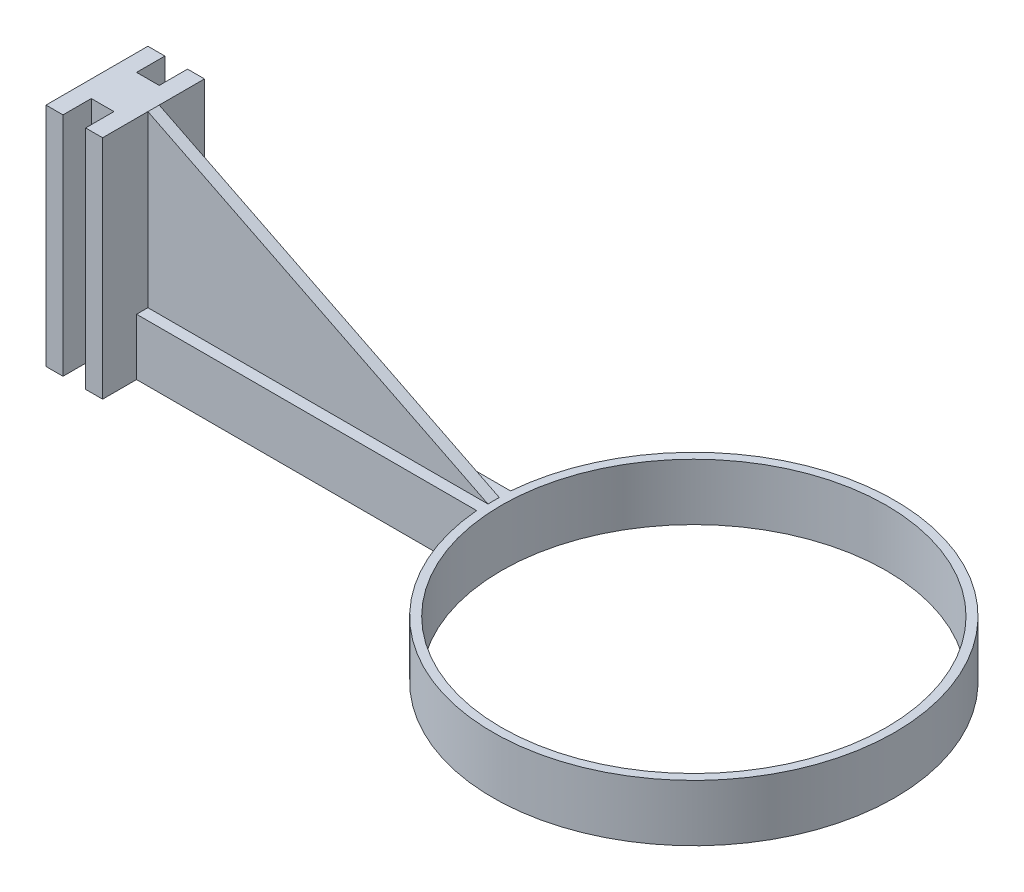
ISO-10303-21;
HEADER;
FILE_DESCRIPTION(('STEP AP214'),'2;1');
FILE_NAME('part.step','',(''),(''),'','','');
FILE_SCHEMA(('AUTOMOTIVE_DESIGN { 1 0 10303 214 1 1 1 1 }'));
ENDSEC;
DATA;
#1=APPLICATION_CONTEXT('core data for automotive mechanical design processes');
#2=APPLICATION_PROTOCOL_DEFINITION('international standard','automotive_design',2000,#1);
#3=PRODUCT_CONTEXT('',#1,'mechanical');
#4=PRODUCT('Part','Part','',(#3));
#5=PRODUCT_RELATED_PRODUCT_CATEGORY('part','',(#4));
#6=PRODUCT_DEFINITION_FORMATION('','',#4);
#7=PRODUCT_DEFINITION_CONTEXT('part definition',#1,'design');
#8=PRODUCT_DEFINITION('design','',#6,#7);
#9=PRODUCT_DEFINITION_SHAPE('','',#8);
#10=(LENGTH_UNIT() NAMED_UNIT(*) SI_UNIT(.MILLI.,.METRE.));
#11=(NAMED_UNIT(*) PLANE_ANGLE_UNIT() SI_UNIT($,.RADIAN.));
#12=(NAMED_UNIT(*) SI_UNIT($,.STERADIAN.) SOLID_ANGLE_UNIT());
#13=UNCERTAINTY_MEASURE_WITH_UNIT(LENGTH_MEASURE(1.E-05),#10,'distance_accuracy_value','');
#14=(GEOMETRIC_REPRESENTATION_CONTEXT(3) GLOBAL_UNCERTAINTY_ASSIGNED_CONTEXT((#13)) GLOBAL_UNIT_ASSIGNED_CONTEXT((#10,
#11,#12)) REPRESENTATION_CONTEXT('',''));
#15=CARTESIAN_POINT('',(0.,0.,0.));
#16=DIRECTION('',(0.,0.,1.));
#17=DIRECTION('',(1.,0.,0.));
#18=AXIS2_PLACEMENT_3D('',#15,#16,#17);
#19=CARTESIAN_POINT('',(0.,5.,0.));
#20=DIRECTION('',(0.,1.,0.));
#21=DIRECTION('',(0.,0.,1.));
#22=AXIS2_PLACEMENT_3D('',#19,#20,#21);
#23=PLANE('',#22);
#24=CARTESIAN_POINT('',(0.,5.,0.));
#25=DIRECTION('',(0.,1.,0.));
#26=DIRECTION('',(0.,0.,1.));
#27=AXIS2_PLACEMENT_3D('',#24,#25,#26);
#28=CIRCLE('',#27,17.);
#29=CARTESIAN_POINT('',(0.,5.,17.));
#30=VERTEX_POINT('',#29);
#31=EDGE_CURVE('E200',#30,#30,#28,.T.);
#32=ORIENTED_EDGE('',*,*,#31,.F.);
#33=EDGE_LOOP('',(#32));
#34=FACE_BOUND('',#33,.T.);
#35=DIRECTION('',(0.,0.,-1.));
#36=VECTOR('',#35,1.);
#37=CARTESIAN_POINT('',(-47.7201518551234,5.,0.));
#38=LINE('',#37,#36);
#39=CARTESIAN_POINT('',(-47.7201518551234,5.,-0.499999999999994));
#40=VERTEX_POINT('',#39);
#41=CARTESIAN_POINT('',(-47.7201518551234,5.,-1.49999999999999));
#42=VERTEX_POINT('',#41);
#43=EDGE_CURVE('E86',#40,#42,#38,.T.);
#44=ORIENTED_EDGE('',*,*,#43,.F.);
#45=DIRECTION('',(1.,0.,0.));
#46=VECTOR('',#45,1.);
#47=CARTESIAN_POINT('',(-17.686506155824,5.,-0.499999999999994));
#48=LINE('',#47,#46);
#49=CARTESIAN_POINT('',(-17.686506155824,5.,-0.499999999999994));
#50=VERTEX_POINT('',#49);
#51=EDGE_CURVE('E177',#40,#50,#48,.T.);
#52=ORIENTED_EDGE('',*,*,#51,.T.);
#53=DIRECTION('',(0.,0.,1.));
#54=VECTOR('',#53,1.);
#55=CARTESIAN_POINT('',(-17.686506155824,5.,-0.499999999999994));
#56=LINE('',#55,#54);
#57=CARTESIAN_POINT('',(-17.686506155824,5.,0.500000000000006));
#58=VERTEX_POINT('',#57);
#59=EDGE_CURVE('E363',#50,#58,#56,.T.);
#60=ORIENTED_EDGE('',*,*,#59,.T.);
#61=DIRECTION('',(1.,0.,0.));
#62=VECTOR('',#61,1.);
#63=CARTESIAN_POINT('',(-17.686506155824,5.,0.500000000000006));
#64=LINE('',#63,#62);
#65=CARTESIAN_POINT('',(-47.7201518551234,5.,0.500000000000006));
#66=VERTEX_POINT('',#65);
#67=EDGE_CURVE('E366',#66,#58,#64,.T.);
#68=ORIENTED_EDGE('',*,*,#67,.F.);
#69=CARTESIAN_POINT('',(-47.7201518551234,5.,1.50000000000001));
#70=VERTEX_POINT('',#69);
#71=EDGE_CURVE('E190',#70,#66,#38,.T.);
#72=ORIENTED_EDGE('',*,*,#71,.F.);
#73=DIRECTION('',(1.,0.,0.));
#74=VECTOR('',#73,1.);
#75=CARTESIAN_POINT('',(0.,5.,1.50000000000001));
#76=LINE('',#75,#74);
#77=CARTESIAN_POINT('',(-17.686506155824,5.,1.50000000000001));
#78=VERTEX_POINT('',#77);
#79=EDGE_CURVE('E193',#70,#78,#76,.T.);
#80=ORIENTED_EDGE('',*,*,#79,.T.);
#81=CARTESIAN_POINT('',(0.,5.,0.));
#82=DIRECTION('',(0.,1.,0.));
#83=DIRECTION('',(0.,0.,1.));
#84=AXIS2_PLACEMENT_3D('',#81,#82,#83);
#85=CIRCLE('',#84,17.75);
#86=CARTESIAN_POINT('',(-17.686506155824,5.,-1.49999999999999));
#87=VERTEX_POINT('',#86);
#88=EDGE_CURVE('E61',#78,#87,#85,.T.);
#89=ORIENTED_EDGE('',*,*,#88,.T.);
#90=DIRECTION('',(1.,0.,0.));
#91=VECTOR('',#90,1.);
#92=CARTESIAN_POINT('',(0.,5.,-1.49999999999999));
#93=LINE('',#92,#91);
#94=EDGE_CURVE('E189',#42,#87,#93,.T.);
#95=ORIENTED_EDGE('',*,*,#94,.F.);
#96=EDGE_LOOP('',(#44,#52,#60,#68,#72,#80,#89,#95));
#97=FACE_BOUND('',#96,.T.);
#98=ADVANCED_FACE('F35',(#34,#97),#23,.T.);
#99=CARTESIAN_POINT('',(-47.7201518551234,20.,0.));
#100=DIRECTION('',(-1.,0.,0.));
#101=DIRECTION('',(0.,0.,1.));
#102=AXIS2_PLACEMENT_3D('',#99,#100,#101);
#103=PLANE('',#102);
#104=DIRECTION('',(0.,-1.,0.));
#105=VECTOR('',#104,1.);
#106=CARTESIAN_POINT('',(-47.7201518551234,5.,-0.499999999999994));
#107=LINE('',#106,#105);
#108=CARTESIAN_POINT('',(-47.7201518551234,20.,-0.499999999999994));
#109=VERTEX_POINT('',#108);
#110=EDGE_CURVE('E179',#109,#40,#107,.T.);
#111=ORIENTED_EDGE('',*,*,#110,.T.);
#112=ORIENTED_EDGE('',*,*,#43,.T.);
#113=DIRECTION('',(0.,-1.,0.));
#114=VECTOR('',#113,1.);
#115=CARTESIAN_POINT('',(-47.7201518551234,5.,-1.49999999999999));
#116=LINE('',#115,#114);
#117=CARTESIAN_POINT('',(-47.7201518551234,0.,-1.49999999999999));
#118=VERTEX_POINT('',#117);
#119=EDGE_CURVE('E11',#42,#118,#116,.T.);
#120=ORIENTED_EDGE('',*,*,#119,.T.);
#121=DIRECTION('',(0.,0.,-1.));
#122=VECTOR('',#121,1.);
#123=CARTESIAN_POINT('',(-47.7201518551234,0.,0.));
#124=LINE('',#123,#122);
#125=CARTESIAN_POINT('',(-47.7201518551234,0.,-4.49999999999999));
#126=VERTEX_POINT('',#125);
#127=EDGE_CURVE('E242',#118,#126,#124,.T.);
#128=ORIENTED_EDGE('',*,*,#127,.T.);
#129=DIRECTION('',(0.,-1.,0.));
#130=VECTOR('',#129,1.);
#131=CARTESIAN_POINT('',(-47.7201518551234,20.,-4.49999999999999));
#132=LINE('',#131,#130);
#133=CARTESIAN_POINT('',(-47.7201518551234,20.,-4.49999999999999));
#134=VERTEX_POINT('',#133);
#135=EDGE_CURVE('E224',#134,#126,#132,.T.);
#136=ORIENTED_EDGE('',*,*,#135,.F.);
#137=DIRECTION('',(0.,0.,-1.));
#138=VECTOR('',#137,1.);
#139=CARTESIAN_POINT('',(-47.7201518551234,20.,0.));
#140=LINE('',#139,#138);
#141=EDGE_CURVE('E186',#109,#134,#140,.T.);
#142=ORIENTED_EDGE('',*,*,#141,.F.);
#143=EDGE_LOOP('',(#111,#112,#120,#128,#136,#142));
#144=FACE_BOUND('',#143,.T.);
#145=ADVANCED_FACE('F184',(#144),#103,.F.);
#146=CARTESIAN_POINT('',(0.,5.,-1.49999999999999));
#147=DIRECTION('',(0.,0.,-1.));
#148=DIRECTION('',(-1.,0.,0.));
#149=AXIS2_PLACEMENT_3D('',#146,#147,#148);
#150=PLANE('',#149);
#151=DIRECTION('',(1.,0.,0.));
#152=VECTOR('',#151,1.);
#153=CARTESIAN_POINT('',(0.,0.,-1.49999999999999));
#154=LINE('',#153,#152);
#155=CARTESIAN_POINT('',(-17.686506155824,0.,-1.49999999999999));
#156=VERTEX_POINT('',#155);
#157=EDGE_CURVE('E214',#118,#156,#154,.T.);
#158=ORIENTED_EDGE('',*,*,#157,.F.);
#159=ORIENTED_EDGE('',*,*,#119,.F.);
#160=ORIENTED_EDGE('',*,*,#94,.T.);
#161=DIRECTION('',(0.,-1.,0.));
#162=VECTOR('',#161,1.);
#163=CARTESIAN_POINT('',(-17.686506155824,5.,-1.49999999999999));
#164=LINE('',#163,#162);
#165=EDGE_CURVE('E79',#87,#156,#164,.T.);
#166=ORIENTED_EDGE('',*,*,#165,.T.);
#167=EDGE_LOOP('',(#158,#159,#160,#166));
#168=FACE_BOUND('',#167,.T.);
#169=ADVANCED_FACE('F37',(#168),#150,.T.);
#170=CARTESIAN_POINT('',(0.,5.,1.50000000000001));
#171=DIRECTION('',(0.,0.,-1.));
#172=DIRECTION('',(-1.,0.,0.));
#173=AXIS2_PLACEMENT_3D('',#170,#171,#172);
#174=PLANE('',#173);
#175=DIRECTION('',(1.,0.,0.));
#176=VECTOR('',#175,1.);
#177=CARTESIAN_POINT('',(0.,0.,1.50000000000001));
#178=LINE('',#177,#176);
#179=CARTESIAN_POINT('',(-47.7201518551234,0.,1.50000000000001));
#180=VERTEX_POINT('',#179);
#181=CARTESIAN_POINT('',(-17.686506155824,0.,1.50000000000001));
#182=VERTEX_POINT('',#181);
#183=EDGE_CURVE('E205',#180,#182,#178,.T.);
#184=ORIENTED_EDGE('',*,*,#183,.T.);
#185=DIRECTION('',(0.,-1.,0.));
#186=VECTOR('',#185,1.);
#187=CARTESIAN_POINT('',(-17.686506155824,5.,1.50000000000001));
#188=LINE('',#187,#186);
#189=EDGE_CURVE('E209',#78,#182,#188,.T.);
#190=ORIENTED_EDGE('',*,*,#189,.F.);
#191=ORIENTED_EDGE('',*,*,#79,.F.);
#192=DIRECTION('',(0.,-1.,0.));
#193=VECTOR('',#192,1.);
#194=CARTESIAN_POINT('',(-47.7201518551234,5.,1.50000000000001));
#195=LINE('',#194,#193);
#196=EDGE_CURVE('E44',#70,#180,#195,.T.);
#197=ORIENTED_EDGE('',*,*,#196,.T.);
#198=EDGE_LOOP('',(#184,#190,#191,#197));
#199=FACE_BOUND('',#198,.T.);
#200=ADVANCED_FACE('F403',(#199),#174,.F.);
#201=CARTESIAN_POINT('',(0.,5.,0.));
#202=DIRECTION('',(0.,-1.,0.));
#203=DIRECTION('',(0.,0.,-1.));
#204=AXIS2_PLACEMENT_3D('',#201,#202,#203);
#205=CYLINDRICAL_SURFACE('',#204,17.75);
#206=CARTESIAN_POINT('',(0.,0.,0.));
#207=DIRECTION('',(0.,1.,0.));
#208=DIRECTION('',(0.,0.,1.));
#209=AXIS2_PLACEMENT_3D('',#206,#207,#208);
#210=CIRCLE('',#209,17.75);
#211=EDGE_CURVE('E203',#182,#156,#210,.T.);
#212=ORIENTED_EDGE('',*,*,#211,.T.);
#213=ORIENTED_EDGE('',*,*,#165,.F.);
#214=ORIENTED_EDGE('',*,*,#88,.F.);
#215=ORIENTED_EDGE('',*,*,#189,.T.);
#216=EDGE_LOOP('',(#212,#213,#214,#215));
#217=FACE_BOUND('',#216,.T.);
#218=ADVANCED_FACE('F400',(#217),#205,.T.);
#219=CARTESIAN_POINT('',(0.,5.,0.));
#220=DIRECTION('',(0.,-1.,0.));
#221=DIRECTION('',(0.,0.,-1.));
#222=AXIS2_PLACEMENT_3D('',#219,#220,#221);
#223=CYLINDRICAL_SURFACE('',#222,17.);
#224=ORIENTED_EDGE('',*,*,#31,.T.);
#225=EDGE_LOOP('',(#224));
#226=FACE_BOUND('',#225,.T.);
#227=CARTESIAN_POINT('',(0.,0.,0.));
#228=DIRECTION('',(0.,1.,0.));
#229=DIRECTION('',(0.,0.,1.));
#230=AXIS2_PLACEMENT_3D('',#227,#228,#229);
#231=CIRCLE('',#230,17.);
#232=CARTESIAN_POINT('',(0.,0.,17.));
#233=VERTEX_POINT('',#232);
#234=EDGE_CURVE('E194',#233,#233,#231,.T.);
#235=ORIENTED_EDGE('',*,*,#234,.F.);
#236=EDGE_LOOP('',(#235));
#237=FACE_BOUND('',#236,.T.);
#238=ADVANCED_FACE('F397',(#226,#237),#223,.F.);
#239=CARTESIAN_POINT('',(0.,0.,0.));
#240=DIRECTION('',(0.,1.,0.));
#241=DIRECTION('',(0.,0.,1.));
#242=AXIS2_PLACEMENT_3D('',#239,#240,#241);
#243=PLANE('',#242);
#244=ORIENTED_EDGE('',*,*,#157,.T.);
#245=ORIENTED_EDGE('',*,*,#211,.F.);
#246=ORIENTED_EDGE('',*,*,#183,.F.);
#247=CARTESIAN_POINT('',(-47.7201518551234,0.,4.50000000000001));
#248=VERTEX_POINT('',#247);
#249=EDGE_CURVE('E238',#248,#180,#124,.T.);
#250=ORIENTED_EDGE('',*,*,#249,.F.);
#251=DIRECTION('',(1.,0.,0.));
#252=VECTOR('',#251,1.);
#253=CARTESIAN_POINT('',(0.,0.,4.50000000000001));
#254=LINE('',#253,#252);
#255=CARTESIAN_POINT('',(-49.2201518551234,0.,4.50000000000001));
#256=VERTEX_POINT('',#255);
#257=EDGE_CURVE('E270',#256,#248,#254,.T.);
#258=ORIENTED_EDGE('',*,*,#257,.F.);
#259=DIRECTION('',(0.,0.,1.));
#260=VECTOR('',#259,1.);
#261=CARTESIAN_POINT('',(-49.2201518551234,0.,0.));
#262=LINE('',#261,#260);
#263=CARTESIAN_POINT('',(-49.2201518551234,0.,2.00000000000001));
#264=VERTEX_POINT('',#263);
#265=EDGE_CURVE('E268',#264,#256,#262,.T.);
#266=ORIENTED_EDGE('',*,*,#265,.F.);
#267=DIRECTION('',(1.,0.,0.));
#268=VECTOR('',#267,1.);
#269=CARTESIAN_POINT('',(0.,0.,2.00000000000001));
#270=LINE('',#269,#268);
#271=CARTESIAN_POINT('',(-51.2201518551234,0.,2.00000000000001));
#272=VERTEX_POINT('',#271);
#273=EDGE_CURVE('E266',#272,#264,#270,.T.);
#274=ORIENTED_EDGE('',*,*,#273,.F.);
#275=DIRECTION('',(0.,0.,-1.));
#276=VECTOR('',#275,1.);
#277=CARTESIAN_POINT('',(-51.2201518551234,0.,0.));
#278=LINE('',#277,#276);
#279=CARTESIAN_POINT('',(-51.2201518551234,0.,4.50000000000001));
#280=VERTEX_POINT('',#279);
#281=EDGE_CURVE('E264',#280,#272,#278,.T.);
#282=ORIENTED_EDGE('',*,*,#281,.F.);
#283=DIRECTION('',(1.,0.,0.));
#284=VECTOR('',#283,1.);
#285=CARTESIAN_POINT('',(0.,0.,4.50000000000001));
#286=LINE('',#285,#284);
#287=CARTESIAN_POINT('',(-52.7201518551234,0.,4.50000000000001));
#288=VERTEX_POINT('',#287);
#289=EDGE_CURVE('E262',#288,#280,#286,.T.);
#290=ORIENTED_EDGE('',*,*,#289,.F.);
#291=DIRECTION('',(0.,0.,1.));
#292=VECTOR('',#291,1.);
#293=CARTESIAN_POINT('',(-52.7201518551234,0.,0.));
#294=LINE('',#293,#292);
#295=CARTESIAN_POINT('',(-52.7201518551234,0.,-4.5));
#296=VERTEX_POINT('',#295);
#297=EDGE_CURVE('E260',#296,#288,#294,.T.);
#298=ORIENTED_EDGE('',*,*,#297,.F.);
#299=DIRECTION('',(-1.,0.,0.));
#300=VECTOR('',#299,1.);
#301=CARTESIAN_POINT('',(0.,0.,-4.5));
#302=LINE('',#301,#300);
#303=CARTESIAN_POINT('',(-51.2201518551234,0.,-4.5));
#304=VERTEX_POINT('',#303);
#305=EDGE_CURVE('E258',#304,#296,#302,.T.);
#306=ORIENTED_EDGE('',*,*,#305,.F.);
#307=DIRECTION('',(0.,0.,-1.));
#308=VECTOR('',#307,1.);
#309=CARTESIAN_POINT('',(-51.2201518551234,0.,0.));
#310=LINE('',#309,#308);
#311=CARTESIAN_POINT('',(-51.2201518551234,0.,-2.));
#312=VERTEX_POINT('',#311);
#313=EDGE_CURVE('E256',#312,#304,#310,.T.);
#314=ORIENTED_EDGE('',*,*,#313,.F.);
#315=DIRECTION('',(1.,0.,0.));
#316=VECTOR('',#315,1.);
#317=CARTESIAN_POINT('',(0.,0.,-1.99999999999984));
#318=LINE('',#317,#316);
#319=CARTESIAN_POINT('',(-49.2201518551234,0.,-1.99999999999999));
#320=VERTEX_POINT('',#319);
#321=EDGE_CURVE('E253',#312,#320,#318,.T.);
#322=ORIENTED_EDGE('',*,*,#321,.T.);
#323=DIRECTION('',(0.,0.,1.));
#324=VECTOR('',#323,1.);
#325=CARTESIAN_POINT('',(-49.2201518551234,0.,0.));
#326=LINE('',#325,#324);
#327=CARTESIAN_POINT('',(-49.2201518551234,0.,-4.49999999999999));
#328=VERTEX_POINT('',#327);
#329=EDGE_CURVE('E250',#328,#320,#326,.T.);
#330=ORIENTED_EDGE('',*,*,#329,.F.);
#331=DIRECTION('',(-1.,0.,0.));
#332=VECTOR('',#331,1.);
#333=CARTESIAN_POINT('',(0.,0.,-4.49999999999999));
#334=LINE('',#333,#332);
#335=EDGE_CURVE('E241',#126,#328,#334,.T.);
#336=ORIENTED_EDGE('',*,*,#335,.F.);
#337=ORIENTED_EDGE('',*,*,#127,.F.);
#338=EDGE_LOOP('',(#244,#245,#246,#250,#258,#266,#274,#282,#290,#298,#306,#314,#322,#330,#336,#337));
#339=FACE_BOUND('',#338,.T.);
#340=ORIENTED_EDGE('',*,*,#234,.T.);
#341=EDGE_LOOP('',(#340));
#342=FACE_BOUND('',#341,.T.);
#343=ADVANCED_FACE('F311',(#339,#342),#243,.F.);
#344=ORIENTED_EDGE('',*,*,#71,.T.);
#345=DIRECTION('',(0.,-1.,0.));
#346=VECTOR('',#345,1.);
#347=CARTESIAN_POINT('',(-47.7201518551234,5.,0.500000000000006));
#348=LINE('',#347,#346);
#349=CARTESIAN_POINT('',(-47.7201518551234,20.,0.500000000000006));
#350=VERTEX_POINT('',#349);
#351=EDGE_CURVE('E354',#350,#66,#348,.T.);
#352=ORIENTED_EDGE('',*,*,#351,.F.);
#353=CARTESIAN_POINT('',(-47.7201518551234,20.,4.50000000000001));
#354=VERTEX_POINT('',#353);
#355=EDGE_CURVE('E346',#354,#350,#140,.T.);
#356=ORIENTED_EDGE('',*,*,#355,.F.);
#357=DIRECTION('',(0.,-1.,0.));
#358=VECTOR('',#357,1.);
#359=CARTESIAN_POINT('',(-47.7201518551234,20.,4.50000000000001));
#360=LINE('',#359,#358);
#361=EDGE_CURVE('E272',#354,#248,#360,.T.);
#362=ORIENTED_EDGE('',*,*,#361,.T.);
#363=ORIENTED_EDGE('',*,*,#249,.T.);
#364=ORIENTED_EDGE('',*,*,#196,.F.);
#365=EDGE_LOOP('',(#344,#352,#356,#362,#363,#364));
#366=FACE_BOUND('',#365,.T.);
#367=ADVANCED_FACE('F353',(#366),#103,.F.);
#368=CARTESIAN_POINT('',(0.,20.,-4.49999999999999));
#369=DIRECTION('',(0.,0.,1.));
#370=DIRECTION('',(1.,0.,0.));
#371=AXIS2_PLACEMENT_3D('',#368,#369,#370);
#372=PLANE('',#371);
#373=ORIENTED_EDGE('',*,*,#335,.T.);
#374=DIRECTION('',(0.,-1.,0.));
#375=VECTOR('',#374,1.);
#376=CARTESIAN_POINT('',(-49.2201518551234,20.,-4.49999999999999));
#377=LINE('',#376,#375);
#378=CARTESIAN_POINT('',(-49.2201518551234,20.,-4.49999999999999));
#379=VERTEX_POINT('',#378);
#380=EDGE_CURVE('E229',#379,#328,#377,.T.);
#381=ORIENTED_EDGE('',*,*,#380,.F.);
#382=DIRECTION('',(-1.,0.,0.));
#383=VECTOR('',#382,1.);
#384=CARTESIAN_POINT('',(0.,20.,-4.49999999999999));
#385=LINE('',#384,#383);
#386=EDGE_CURVE('E355',#134,#379,#385,.T.);
#387=ORIENTED_EDGE('',*,*,#386,.F.);
#388=ORIENTED_EDGE('',*,*,#135,.T.);
#389=EDGE_LOOP('',(#373,#381,#387,#388));
#390=FACE_BOUND('',#389,.T.);
#391=ADVANCED_FACE('F362',(#390),#372,.F.);
#392=CARTESIAN_POINT('',(-49.2201518551234,20.,0.));
#393=DIRECTION('',(1.,0.,0.));
#394=DIRECTION('',(0.,0.,-1.));
#395=AXIS2_PLACEMENT_3D('',#392,#393,#394);
#396=PLANE('',#395);
#397=ORIENTED_EDGE('',*,*,#329,.T.);
#398=DIRECTION('',(0.,-1.,0.));
#399=VECTOR('',#398,1.);
#400=CARTESIAN_POINT('',(-49.2201518551234,20.,-1.99999999999999));
#401=LINE('',#400,#399);
#402=CARTESIAN_POINT('',(-49.2201518551234,20.,-1.99999999999999));
#403=VERTEX_POINT('',#402);
#404=EDGE_CURVE('E234',#403,#320,#401,.T.);
#405=ORIENTED_EDGE('',*,*,#404,.F.);
#406=DIRECTION('',(0.,0.,1.));
#407=VECTOR('',#406,1.);
#408=CARTESIAN_POINT('',(-49.2201518551234,20.,0.));
#409=LINE('',#408,#407);
#410=EDGE_CURVE('E357',#379,#403,#409,.T.);
#411=ORIENTED_EDGE('',*,*,#410,.F.);
#412=ORIENTED_EDGE('',*,*,#380,.T.);
#413=EDGE_LOOP('',(#397,#405,#411,#412));
#414=FACE_BOUND('',#413,.T.);
#415=ADVANCED_FACE('F307',(#414),#396,.F.);
#416=CARTESIAN_POINT('',(0.,20.,-1.99999999999984));
#417=DIRECTION('',(0.,0.,-1.));
#418=DIRECTION('',(-1.,0.,0.));
#419=AXIS2_PLACEMENT_3D('',#416,#417,#418);
#420=PLANE('',#419);
#421=ORIENTED_EDGE('',*,*,#321,.F.);
#422=DIRECTION('',(0.,-1.,0.));
#423=VECTOR('',#422,1.);
#424=CARTESIAN_POINT('',(-51.2201518551234,20.,-2.));
#425=LINE('',#424,#423);
#426=CARTESIAN_POINT('',(-51.2201518551234,20.,-2.));
#427=VERTEX_POINT('',#426);
#428=EDGE_CURVE('E296',#427,#312,#425,.T.);
#429=ORIENTED_EDGE('',*,*,#428,.F.);
#430=DIRECTION('',(1.,0.,0.));
#431=VECTOR('',#430,1.);
#432=CARTESIAN_POINT('',(0.,20.,-1.99999999999984));
#433=LINE('',#432,#431);
#434=EDGE_CURVE('E303',#427,#403,#433,.T.);
#435=ORIENTED_EDGE('',*,*,#434,.T.);
#436=ORIENTED_EDGE('',*,*,#404,.T.);
#437=EDGE_LOOP('',(#421,#429,#435,#436));
#438=FACE_BOUND('',#437,.T.);
#439=ADVANCED_FACE('F301',(#438),#420,.T.);
#440=CARTESIAN_POINT('',(-51.2201518551234,20.,0.));
#441=DIRECTION('',(-1.,0.,0.));
#442=DIRECTION('',(0.,0.,1.));
#443=AXIS2_PLACEMENT_3D('',#440,#441,#442);
#444=PLANE('',#443);
#445=ORIENTED_EDGE('',*,*,#313,.T.);
#446=DIRECTION('',(0.,-1.,0.));
#447=VECTOR('',#446,1.);
#448=CARTESIAN_POINT('',(-51.2201518551234,20.,-4.5));
#449=LINE('',#448,#447);
#450=CARTESIAN_POINT('',(-51.2201518551234,20.,-4.5));
#451=VERTEX_POINT('',#450);
#452=EDGE_CURVE('E293',#451,#304,#449,.T.);
#453=ORIENTED_EDGE('',*,*,#452,.F.);
#454=DIRECTION('',(0.,0.,-1.));
#455=VECTOR('',#454,1.);
#456=CARTESIAN_POINT('',(-51.2201518551234,20.,0.));
#457=LINE('',#456,#455);
#458=EDGE_CURVE('E327',#427,#451,#457,.T.);
#459=ORIENTED_EDGE('',*,*,#458,.F.);
#460=ORIENTED_EDGE('',*,*,#428,.T.);
#461=EDGE_LOOP('',(#445,#453,#459,#460));
#462=FACE_BOUND('',#461,.T.);
#463=ADVANCED_FACE('F317',(#462),#444,.F.);
#464=CARTESIAN_POINT('',(0.,20.,-4.5));
#465=DIRECTION('',(0.,0.,1.));
#466=DIRECTION('',(1.,0.,0.));
#467=AXIS2_PLACEMENT_3D('',#464,#465,#466);
#468=PLANE('',#467);
#469=ORIENTED_EDGE('',*,*,#305,.T.);
#470=DIRECTION('',(0.,-1.,0.));
#471=VECTOR('',#470,1.);
#472=CARTESIAN_POINT('',(-52.7201518551234,20.,-4.5));
#473=LINE('',#472,#471);
#474=CARTESIAN_POINT('',(-52.7201518551234,20.,-4.5));
#475=VERTEX_POINT('',#474);
#476=EDGE_CURVE('E290',#475,#296,#473,.T.);
#477=ORIENTED_EDGE('',*,*,#476,.F.);
#478=DIRECTION('',(-1.,0.,0.));
#479=VECTOR('',#478,1.);
#480=CARTESIAN_POINT('',(0.,20.,-4.5));
#481=LINE('',#480,#479);
#482=EDGE_CURVE('E323',#451,#475,#481,.T.);
#483=ORIENTED_EDGE('',*,*,#482,.F.);
#484=ORIENTED_EDGE('',*,*,#452,.T.);
#485=EDGE_LOOP('',(#469,#477,#483,#484));
#486=FACE_BOUND('',#485,.T.);
#487=ADVANCED_FACE('F321',(#486),#468,.F.);
#488=CARTESIAN_POINT('',(-52.7201518551234,20.,0.));
#489=DIRECTION('',(1.,0.,0.));
#490=DIRECTION('',(0.,0.,-1.));
#491=AXIS2_PLACEMENT_3D('',#488,#489,#490);
#492=PLANE('',#491);
#493=ORIENTED_EDGE('',*,*,#297,.T.);
#494=DIRECTION('',(0.,-1.,0.));
#495=VECTOR('',#494,1.);
#496=CARTESIAN_POINT('',(-52.7201518551234,20.,4.50000000000001));
#497=LINE('',#496,#495);
#498=CARTESIAN_POINT('',(-52.7201518551234,20.,4.50000000000001));
#499=VERTEX_POINT('',#498);
#500=EDGE_CURVE('E287',#499,#288,#497,.T.);
#501=ORIENTED_EDGE('',*,*,#500,.F.);
#502=DIRECTION('',(0.,0.,1.));
#503=VECTOR('',#502,1.);
#504=CARTESIAN_POINT('',(-52.7201518551234,20.,0.));
#505=LINE('',#504,#503);
#506=EDGE_CURVE('E326',#475,#499,#505,.T.);
#507=ORIENTED_EDGE('',*,*,#506,.F.);
#508=ORIENTED_EDGE('',*,*,#476,.T.);
#509=EDGE_LOOP('',(#493,#501,#507,#508));
#510=FACE_BOUND('',#509,.T.);
#511=ADVANCED_FACE('F502',(#510),#492,.F.);
#512=CARTESIAN_POINT('',(0.,20.,4.50000000000001));
#513=DIRECTION('',(0.,0.,-1.));
#514=DIRECTION('',(-1.,0.,0.));
#515=AXIS2_PLACEMENT_3D('',#512,#513,#514);
#516=PLANE('',#515);
#517=ORIENTED_EDGE('',*,*,#289,.T.);
#518=DIRECTION('',(0.,-1.,0.));
#519=VECTOR('',#518,1.);
#520=CARTESIAN_POINT('',(-51.2201518551234,20.,4.50000000000001));
#521=LINE('',#520,#519);
#522=CARTESIAN_POINT('',(-51.2201518551234,20.,4.50000000000001));
#523=VERTEX_POINT('',#522);
#524=EDGE_CURVE('E284',#523,#280,#521,.T.);
#525=ORIENTED_EDGE('',*,*,#524,.F.);
#526=DIRECTION('',(1.,0.,0.));
#527=VECTOR('',#526,1.);
#528=CARTESIAN_POINT('',(0.,20.,4.50000000000001));
#529=LINE('',#528,#527);
#530=EDGE_CURVE('E329',#499,#523,#529,.T.);
#531=ORIENTED_EDGE('',*,*,#530,.F.);
#532=ORIENTED_EDGE('',*,*,#500,.T.);
#533=EDGE_LOOP('',(#517,#525,#531,#532));
#534=FACE_BOUND('',#533,.T.);
#535=ADVANCED_FACE('F494',(#534),#516,.F.);
#536=CARTESIAN_POINT('',(-51.2201518551234,20.,0.));
#537=DIRECTION('',(-1.,0.,0.));
#538=DIRECTION('',(0.,0.,1.));
#539=AXIS2_PLACEMENT_3D('',#536,#537,#538);
#540=PLANE('',#539);
#541=ORIENTED_EDGE('',*,*,#281,.T.);
#542=DIRECTION('',(0.,-1.,0.));
#543=VECTOR('',#542,1.);
#544=CARTESIAN_POINT('',(-51.2201518551234,20.,2.00000000000001));
#545=LINE('',#544,#543);
#546=CARTESIAN_POINT('',(-51.2201518551234,20.,2.00000000000001));
#547=VERTEX_POINT('',#546);
#548=EDGE_CURVE('E281',#547,#272,#545,.T.);
#549=ORIENTED_EDGE('',*,*,#548,.F.);
#550=DIRECTION('',(0.,0.,-1.));
#551=VECTOR('',#550,1.);
#552=CARTESIAN_POINT('',(-51.2201518551234,20.,0.));
#553=LINE('',#552,#551);
#554=EDGE_CURVE('E335',#523,#547,#553,.T.);
#555=ORIENTED_EDGE('',*,*,#554,.F.);
#556=ORIENTED_EDGE('',*,*,#524,.T.);
#557=EDGE_LOOP('',(#541,#549,#555,#556));
#558=FACE_BOUND('',#557,.T.);
#559=ADVANCED_FACE('F486',(#558),#540,.F.);
#560=CARTESIAN_POINT('',(0.,20.,2.00000000000001));
#561=DIRECTION('',(0.,0.,-1.));
#562=DIRECTION('',(-1.,0.,0.));
#563=AXIS2_PLACEMENT_3D('',#560,#561,#562);
#564=PLANE('',#563);
#565=ORIENTED_EDGE('',*,*,#273,.T.);
#566=DIRECTION('',(0.,-1.,0.));
#567=VECTOR('',#566,1.);
#568=CARTESIAN_POINT('',(-49.2201518551234,20.,2.00000000000001));
#569=LINE('',#568,#567);
#570=CARTESIAN_POINT('',(-49.2201518551234,20.,2.00000000000001));
#571=VERTEX_POINT('',#570);
#572=EDGE_CURVE('E278',#571,#264,#569,.T.);
#573=ORIENTED_EDGE('',*,*,#572,.F.);
#574=DIRECTION('',(1.,0.,0.));
#575=VECTOR('',#574,1.);
#576=CARTESIAN_POINT('',(0.,20.,2.00000000000001));
#577=LINE('',#576,#575);
#578=EDGE_CURVE('E337',#547,#571,#577,.T.);
#579=ORIENTED_EDGE('',*,*,#578,.F.);
#580=ORIENTED_EDGE('',*,*,#548,.T.);
#581=EDGE_LOOP('',(#565,#573,#579,#580));
#582=FACE_BOUND('',#581,.T.);
#583=ADVANCED_FACE('F478',(#582),#564,.F.);
#584=CARTESIAN_POINT('',(-49.2201518551234,20.,0.));
#585=DIRECTION('',(1.,0.,0.));
#586=DIRECTION('',(0.,0.,-1.));
#587=AXIS2_PLACEMENT_3D('',#584,#585,#586);
#588=PLANE('',#587);
#589=ORIENTED_EDGE('',*,*,#265,.T.);
#590=DIRECTION('',(0.,-1.,0.));
#591=VECTOR('',#590,1.);
#592=CARTESIAN_POINT('',(-49.2201518551234,20.,4.50000000000001));
#593=LINE('',#592,#591);
#594=CARTESIAN_POINT('',(-49.2201518551234,20.,4.50000000000001));
#595=VERTEX_POINT('',#594);
#596=EDGE_CURVE('E275',#595,#256,#593,.T.);
#597=ORIENTED_EDGE('',*,*,#596,.F.);
#598=DIRECTION('',(0.,0.,1.));
#599=VECTOR('',#598,1.);
#600=CARTESIAN_POINT('',(-49.2201518551234,20.,0.));
#601=LINE('',#600,#599);
#602=EDGE_CURVE('E338',#571,#595,#601,.T.);
#603=ORIENTED_EDGE('',*,*,#602,.F.);
#604=ORIENTED_EDGE('',*,*,#572,.T.);
#605=EDGE_LOOP('',(#589,#597,#603,#604));
#606=FACE_BOUND('',#605,.T.);
#607=ADVANCED_FACE('F471',(#606),#588,.F.);
#608=CARTESIAN_POINT('',(0.,20.,4.50000000000001));
#609=DIRECTION('',(0.,0.,-1.));
#610=DIRECTION('',(-1.,0.,0.));
#611=AXIS2_PLACEMENT_3D('',#608,#609,#610);
#612=PLANE('',#611);
#613=ORIENTED_EDGE('',*,*,#257,.T.);
#614=ORIENTED_EDGE('',*,*,#361,.F.);
#615=DIRECTION('',(1.,0.,0.));
#616=VECTOR('',#615,1.);
#617=CARTESIAN_POINT('',(0.,20.,4.50000000000001));
#618=LINE('',#617,#616);
#619=EDGE_CURVE('E246',#595,#354,#618,.T.);
#620=ORIENTED_EDGE('',*,*,#619,.F.);
#621=ORIENTED_EDGE('',*,*,#596,.T.);
#622=EDGE_LOOP('',(#613,#614,#620,#621));
#623=FACE_BOUND('',#622,.T.);
#624=ADVANCED_FACE('F348',(#623),#612,.F.);
#625=CARTESIAN_POINT('',(0.,20.,0.));
#626=DIRECTION('',(0.,1.,0.));
#627=DIRECTION('',(0.,0.,1.));
#628=AXIS2_PLACEMENT_3D('',#625,#626,#627);
#629=PLANE('',#628);
#630=ORIENTED_EDGE('',*,*,#355,.T.);
#631=DIRECTION('',(0.,0.,1.));
#632=VECTOR('',#631,1.);
#633=CARTESIAN_POINT('',(-47.7201518551234,20.,-0.499999999999994));
#634=LINE('',#633,#632);
#635=EDGE_CURVE('E182',#109,#350,#634,.T.);
#636=ORIENTED_EDGE('',*,*,#635,.F.);
#637=ORIENTED_EDGE('',*,*,#141,.T.);
#638=ORIENTED_EDGE('',*,*,#386,.T.);
#639=ORIENTED_EDGE('',*,*,#410,.T.);
#640=ORIENTED_EDGE('',*,*,#434,.F.);
#641=ORIENTED_EDGE('',*,*,#458,.T.);
#642=ORIENTED_EDGE('',*,*,#482,.T.);
#643=ORIENTED_EDGE('',*,*,#506,.T.);
#644=ORIENTED_EDGE('',*,*,#530,.T.);
#645=ORIENTED_EDGE('',*,*,#554,.T.);
#646=ORIENTED_EDGE('',*,*,#578,.T.);
#647=ORIENTED_EDGE('',*,*,#602,.T.);
#648=ORIENTED_EDGE('',*,*,#619,.T.);
#649=EDGE_LOOP('',(#630,#636,#637,#638,#639,#640,#641,#642,#643,#644,#645,#646,#647,#648));
#650=FACE_BOUND('',#649,.T.);
#651=ADVANCED_FACE('F344',(#650),#629,.T.);
#652=CARTESIAN_POINT('',(-47.7201518551234,20.,-0.499999999999994));
#653=DIRECTION('',(0.44681266192723,0.894627545485552,0.));
#654=DIRECTION('',(-0.894627545485552,0.44681266192723,0.));
#655=AXIS2_PLACEMENT_3D('',#652,#653,#654);
#656=PLANE('',#655);
#657=DIRECTION('',(-0.894627545485552,0.44681266192723,0.));
#658=VECTOR('',#657,1.);
#659=CARTESIAN_POINT('',(-47.7201518551234,20.,0.500000000000006));
#660=LINE('',#659,#658);
#661=EDGE_CURVE('E370',#58,#350,#660,.T.);
#662=ORIENTED_EDGE('',*,*,#661,.F.);
#663=ORIENTED_EDGE('',*,*,#59,.F.);
#664=DIRECTION('',(-0.894627545485552,0.44681266192723,0.));
#665=VECTOR('',#664,1.);
#666=CARTESIAN_POINT('',(-47.7201518551234,20.,-0.499999999999994));
#667=LINE('',#666,#665);
#668=EDGE_CURVE('E52',#50,#109,#667,.T.);
#669=ORIENTED_EDGE('',*,*,#668,.T.);
#670=ORIENTED_EDGE('',*,*,#635,.T.);
#671=EDGE_LOOP('',(#662,#663,#669,#670));
#672=FACE_BOUND('',#671,.T.);
#673=ADVANCED_FACE('F375',(#672),#656,.T.);
#674=CARTESIAN_POINT('',(0.,0.,-0.499999999999994));
#675=DIRECTION('',(0.,0.,1.));
#676=DIRECTION('',(1.,0.,0.));
#677=AXIS2_PLACEMENT_3D('',#674,#675,#676);
#678=PLANE('',#677);
#679=ORIENTED_EDGE('',*,*,#668,.F.);
#680=ORIENTED_EDGE('',*,*,#51,.F.);
#681=ORIENTED_EDGE('',*,*,#110,.F.);
#682=EDGE_LOOP('',(#679,#680,#681));
#683=FACE_BOUND('',#682,.T.);
#684=ADVANCED_FACE('F178',(#683),#678,.F.);
#685=CARTESIAN_POINT('',(0.,0.,0.500000000000006));
#686=DIRECTION('',(0.,0.,1.));
#687=DIRECTION('',(1.,0.,0.));
#688=AXIS2_PLACEMENT_3D('',#685,#686,#687);
#689=PLANE('',#688);
#690=ORIENTED_EDGE('',*,*,#661,.T.);
#691=ORIENTED_EDGE('',*,*,#351,.T.);
#692=ORIENTED_EDGE('',*,*,#67,.T.);
#693=EDGE_LOOP('',(#690,#691,#692));
#694=FACE_BOUND('',#693,.T.);
#695=ADVANCED_FACE('F374',(#694),#689,.T.);
#696=CLOSED_SHELL('',(#98,#145,#169,#200,#218,#238,#343,#367,#391,#415,#439,#463,#487,#511,#535,
#559,#583,#607,#624,#651,#673,#684,#695));
#697=MANIFOLD_SOLID_BREP('B2',#696);
#698=ADVANCED_BREP_SHAPE_REPRESENTATION('',(#18,#697),#14);
#699=SHAPE_DEFINITION_REPRESENTATION(#9,#698);
ENDSEC;
END-ISO-10303-21;
